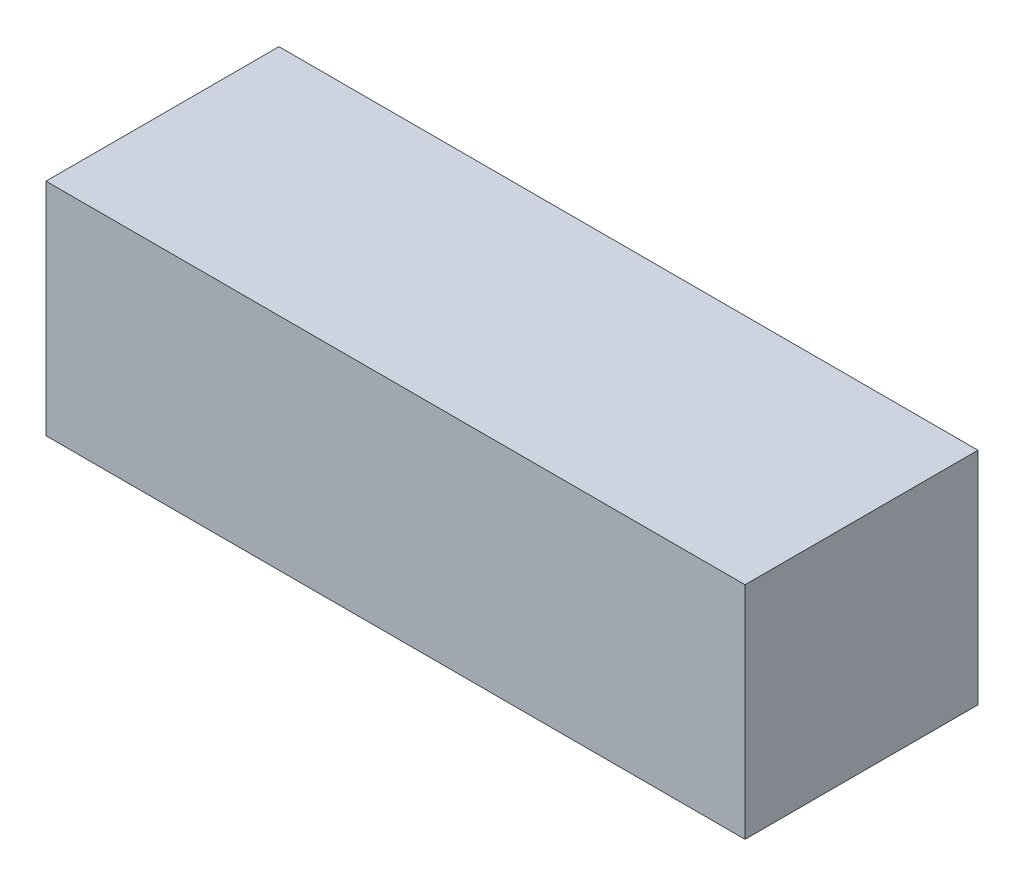
ISO-10303-21;
HEADER;
FILE_DESCRIPTION(('STEP AP214'),'2;1');
FILE_NAME('part.step','',(''),(''),'','','');
FILE_SCHEMA(('AUTOMOTIVE_DESIGN { 1 0 10303 214 1 1 1 1 }'));
ENDSEC;
DATA;
#1=APPLICATION_CONTEXT('core data for automotive mechanical design processes');
#2=APPLICATION_PROTOCOL_DEFINITION('international standard','automotive_design',2000,#1);
#3=PRODUCT_CONTEXT('',#1,'mechanical');
#4=PRODUCT('Part','Part','',(#3));
#5=PRODUCT_RELATED_PRODUCT_CATEGORY('part','',(#4));
#6=PRODUCT_DEFINITION_FORMATION('','',#4);
#7=PRODUCT_DEFINITION_CONTEXT('part definition',#1,'design');
#8=PRODUCT_DEFINITION('design','',#6,#7);
#9=PRODUCT_DEFINITION_SHAPE('','',#8);
#10=(LENGTH_UNIT() NAMED_UNIT(*) SI_UNIT(.MILLI.,.METRE.));
#11=(NAMED_UNIT(*) PLANE_ANGLE_UNIT() SI_UNIT($,.RADIAN.));
#12=(NAMED_UNIT(*) SI_UNIT($,.STERADIAN.) SOLID_ANGLE_UNIT());
#13=UNCERTAINTY_MEASURE_WITH_UNIT(LENGTH_MEASURE(1.E-05),#10,'distance_accuracy_value','');
#14=(GEOMETRIC_REPRESENTATION_CONTEXT(3) GLOBAL_UNCERTAINTY_ASSIGNED_CONTEXT((#13)) GLOBAL_UNIT_ASSIGNED_CONTEXT((#10,
#11,#12)) REPRESENTATION_CONTEXT('',''));
#15=CARTESIAN_POINT('',(0.,0.,0.));
#16=DIRECTION('',(0.,0.,1.));
#17=DIRECTION('',(1.,0.,0.));
#18=AXIS2_PLACEMENT_3D('',#15,#16,#17);
#19=CARTESIAN_POINT('',(127.,15.494774015322,12.6981562662151));
#20=DIRECTION('',(0.,0.,-1.));
#21=DIRECTION('',(-1.,0.,0.));
#22=AXIS2_PLACEMENT_3D('',#19,#20,#21);
#23=PLANE('',#22);
#24=DIRECTION('',(0.,-1.,0.));
#25=VECTOR('',#24,1.);
#26=CARTESIAN_POINT('',(0.,15.494774015322,12.6981562662151));
#27=LINE('',#26,#25);
#28=CARTESIAN_POINT('',(0.,15.494774015322,12.6981562662151));
#29=VERTEX_POINT('',#28);
#30=CARTESIAN_POINT('',(0.,-24.564885634047,12.6981562662151));
#31=VERTEX_POINT('',#30);
#32=EDGE_CURVE('E106',#29,#31,#27,.T.);
#33=ORIENTED_EDGE('',*,*,#32,.T.);
#34=DIRECTION('',(-1.,0.,0.));
#35=VECTOR('',#34,1.);
#36=CARTESIAN_POINT('',(127.,-24.564885634047,12.6981562662151));
#37=LINE('',#36,#35);
#38=CARTESIAN_POINT('',(127.,-24.564885634047,12.6981562662151));
#39=VERTEX_POINT('',#38);
#40=EDGE_CURVE('E11',#39,#31,#37,.T.);
#41=ORIENTED_EDGE('',*,*,#40,.F.);
#42=DIRECTION('',(0.,-1.,0.));
#43=VECTOR('',#42,1.);
#44=CARTESIAN_POINT('',(127.,15.494774015322,12.6981562662151));
#45=LINE('',#44,#43);
#46=CARTESIAN_POINT('',(127.,15.494774015322,12.6981562662151));
#47=VERTEX_POINT('',#46);
#48=EDGE_CURVE('E94',#47,#39,#45,.T.);
#49=ORIENTED_EDGE('',*,*,#48,.F.);
#50=DIRECTION('',(-1.,0.,0.));
#51=VECTOR('',#50,1.);
#52=CARTESIAN_POINT('',(127.,15.494774015322,12.6981562662151));
#53=LINE('',#52,#51);
#54=EDGE_CURVE('E102',#47,#29,#53,.T.);
#55=ORIENTED_EDGE('',*,*,#54,.T.);
#56=EDGE_LOOP('',(#33,#41,#49,#55));
#57=FACE_BOUND('',#56,.T.);
#58=ADVANCED_FACE('F43',(#57),#23,.F.);
#59=CARTESIAN_POINT('',(127.,-24.564885634047,12.6981562662151));
#60=DIRECTION('',(0.,1.,0.));
#61=DIRECTION('',(0.,0.,1.));
#62=AXIS2_PLACEMENT_3D('',#59,#60,#61);
#63=PLANE('',#62);
#64=DIRECTION('',(0.,0.,-1.));
#65=VECTOR('',#64,1.);
#66=CARTESIAN_POINT('',(0.,-24.564885634047,12.6981562662151));
#67=LINE('',#66,#65);
#68=CARTESIAN_POINT('',(0.,-24.564885634047,-29.6290312878352));
#69=VERTEX_POINT('',#68);
#70=EDGE_CURVE('E98',#31,#69,#67,.T.);
#71=ORIENTED_EDGE('',*,*,#70,.T.);
#72=DIRECTION('',(-1.,0.,0.));
#73=VECTOR('',#72,1.);
#74=CARTESIAN_POINT('',(127.,-24.564885634047,-29.6290312878352));
#75=LINE('',#74,#73);
#76=CARTESIAN_POINT('',(127.,-24.564885634047,-29.6290312878352));
#77=VERTEX_POINT('',#76);
#78=EDGE_CURVE('E51',#77,#69,#75,.T.);
#79=ORIENTED_EDGE('',*,*,#78,.F.);
#80=DIRECTION('',(0.,0.,-1.));
#81=VECTOR('',#80,1.);
#82=CARTESIAN_POINT('',(127.,-24.564885634047,12.6981562662151));
#83=LINE('',#82,#81);
#84=EDGE_CURVE('E89',#39,#77,#83,.T.);
#85=ORIENTED_EDGE('',*,*,#84,.F.);
#86=ORIENTED_EDGE('',*,*,#40,.T.);
#87=EDGE_LOOP('',(#71,#79,#85,#86));
#88=FACE_BOUND('',#87,.T.);
#89=ADVANCED_FACE('F97',(#88),#63,.F.);
#90=CARTESIAN_POINT('',(127.,15.494774015322,-29.6290312878352));
#91=DIRECTION('',(0.,0.,1.));
#92=DIRECTION('',(1.,0.,0.));
#93=AXIS2_PLACEMENT_3D('',#90,#91,#92);
#94=PLANE('',#93);
#95=DIRECTION('',(0.,1.,0.));
#96=VECTOR('',#95,1.);
#97=CARTESIAN_POINT('',(0.,15.494774015322,-29.6290312878352));
#98=LINE('',#97,#96);
#99=CARTESIAN_POINT('',(0.,15.494774015322,-29.6290312878352));
#100=VERTEX_POINT('',#99);
#101=EDGE_CURVE('E76',#69,#100,#98,.T.);
#102=ORIENTED_EDGE('',*,*,#101,.T.);
#103=DIRECTION('',(-1.,0.,0.));
#104=VECTOR('',#103,1.);
#105=CARTESIAN_POINT('',(127.,15.494774015322,-29.6290312878352));
#106=LINE('',#105,#104);
#107=CARTESIAN_POINT('',(127.,15.494774015322,-29.6290312878352));
#108=VERTEX_POINT('',#107);
#109=EDGE_CURVE('E99',#108,#100,#106,.T.);
#110=ORIENTED_EDGE('',*,*,#109,.F.);
#111=DIRECTION('',(0.,1.,0.));
#112=VECTOR('',#111,1.);
#113=CARTESIAN_POINT('',(127.,15.494774015322,-29.6290312878352));
#114=LINE('',#113,#112);
#115=EDGE_CURVE('E92',#77,#108,#114,.T.);
#116=ORIENTED_EDGE('',*,*,#115,.F.);
#117=ORIENTED_EDGE('',*,*,#78,.T.);
#118=EDGE_LOOP('',(#102,#110,#116,#117));
#119=FACE_BOUND('',#118,.T.);
#120=ADVANCED_FACE('F100',(#119),#94,.F.);
#121=CARTESIAN_POINT('',(127.,15.494774015322,12.6981562662151));
#122=DIRECTION('',(0.,-1.,0.));
#123=DIRECTION('',(0.,0.,-1.));
#124=AXIS2_PLACEMENT_3D('',#121,#122,#123);
#125=PLANE('',#124);
#126=DIRECTION('',(0.,0.,1.));
#127=VECTOR('',#126,1.);
#128=CARTESIAN_POINT('',(0.,15.494774015322,12.6981562662151));
#129=LINE('',#128,#127);
#130=EDGE_CURVE('E82',#100,#29,#129,.T.);
#131=ORIENTED_EDGE('',*,*,#130,.T.);
#132=ORIENTED_EDGE('',*,*,#54,.F.);
#133=DIRECTION('',(0.,0.,1.));
#134=VECTOR('',#133,1.);
#135=CARTESIAN_POINT('',(127.,15.494774015322,12.6981562662151));
#136=LINE('',#135,#134);
#137=EDGE_CURVE('E59',#108,#47,#136,.T.);
#138=ORIENTED_EDGE('',*,*,#137,.F.);
#139=ORIENTED_EDGE('',*,*,#109,.T.);
#140=EDGE_LOOP('',(#131,#132,#138,#139));
#141=FACE_BOUND('',#140,.T.);
#142=ADVANCED_FACE('F113',(#141),#125,.F.);
#143=CARTESIAN_POINT('',(127.,0.,0.));
#144=DIRECTION('',(1.,0.,0.));
#145=DIRECTION('',(0.,0.,-1.));
#146=AXIS2_PLACEMENT_3D('',#143,#144,#145);
#147=PLANE('',#146);
#148=ORIENTED_EDGE('',*,*,#48,.T.);
#149=ORIENTED_EDGE('',*,*,#84,.T.);
#150=ORIENTED_EDGE('',*,*,#115,.T.);
#151=ORIENTED_EDGE('',*,*,#137,.T.);
#152=EDGE_LOOP('',(#148,#149,#150,#151));
#153=FACE_BOUND('',#152,.T.);
#154=ADVANCED_FACE('F90',(#153),#147,.T.);
#155=CARTESIAN_POINT('',(0.,0.,0.));
#156=DIRECTION('',(1.,0.,0.));
#157=DIRECTION('',(0.,0.,-1.));
#158=AXIS2_PLACEMENT_3D('',#155,#156,#157);
#159=PLANE('',#158);
#160=ORIENTED_EDGE('',*,*,#32,.F.);
#161=ORIENTED_EDGE('',*,*,#130,.F.);
#162=ORIENTED_EDGE('',*,*,#101,.F.);
#163=ORIENTED_EDGE('',*,*,#70,.F.);
#164=EDGE_LOOP('',(#160,#161,#162,#163));
#165=FACE_BOUND('',#164,.T.);
#166=ADVANCED_FACE('F116',(#165),#159,.F.);
#167=CLOSED_SHELL('',(#58,#89,#120,#142,#154,#166));
#168=MANIFOLD_SOLID_BREP('B2',#167);
#169=ADVANCED_BREP_SHAPE_REPRESENTATION('',(#18,#168),#14);
#170=SHAPE_DEFINITION_REPRESENTATION(#9,#169);
ENDSEC;
END-ISO-10303-21;
